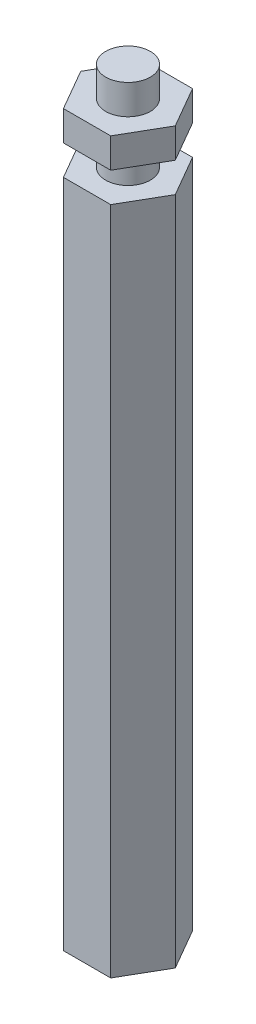
ISO-10303-21;
HEADER;
FILE_DESCRIPTION(('STEP AP214'),'2;1');
FILE_NAME('part.step','',(''),(''),'','','');
FILE_SCHEMA(('AUTOMOTIVE_DESIGN { 1 0 10303 214 1 1 1 1 }'));
ENDSEC;
DATA;
#1=APPLICATION_CONTEXT('core data for automotive mechanical design processes');
#2=APPLICATION_PROTOCOL_DEFINITION('international standard','automotive_design',2000,#1);
#3=PRODUCT_CONTEXT('',#1,'mechanical');
#4=PRODUCT('Part','Part','',(#3));
#5=PRODUCT_RELATED_PRODUCT_CATEGORY('part','',(#4));
#6=PRODUCT_DEFINITION_FORMATION('','',#4);
#7=PRODUCT_DEFINITION_CONTEXT('part definition',#1,'design');
#8=PRODUCT_DEFINITION('design','',#6,#7);
#9=PRODUCT_DEFINITION_SHAPE('','',#8);
#10=(LENGTH_UNIT() NAMED_UNIT(*) SI_UNIT(.MILLI.,.METRE.));
#11=(NAMED_UNIT(*) PLANE_ANGLE_UNIT() SI_UNIT($,.RADIAN.));
#12=(NAMED_UNIT(*) SI_UNIT($,.STERADIAN.) SOLID_ANGLE_UNIT());
#13=UNCERTAINTY_MEASURE_WITH_UNIT(LENGTH_MEASURE(1.E-05),#10,'distance_accuracy_value','');
#14=(GEOMETRIC_REPRESENTATION_CONTEXT(3) GLOBAL_UNCERTAINTY_ASSIGNED_CONTEXT((#13)) GLOBAL_UNIT_ASSIGNED_CONTEXT((#10,
#11,#12)) REPRESENTATION_CONTEXT('',''));
#15=CARTESIAN_POINT('',(0.,0.,0.));
#16=DIRECTION('',(0.,0.,1.));
#17=DIRECTION('',(1.,0.,0.));
#18=AXIS2_PLACEMENT_3D('',#15,#16,#17);
#19=CARTESIAN_POINT('',(0.,51.,0.));
#20=DIRECTION('',(0.,1.,0.));
#21=DIRECTION('',(0.,0.,1.));
#22=AXIS2_PLACEMENT_3D('',#19,#20,#21);
#23=PLANE('',#22);
#24=CARTESIAN_POINT('',(0.,51.,0.));
#25=DIRECTION('',(0.,-1.,0.));
#26=DIRECTION('',(0.,0.,-1.));
#27=AXIS2_PLACEMENT_3D('',#24,#25,#26);
#28=CIRCLE('',#27,1.5);
#29=CARTESIAN_POINT('',(0.,51.,-1.5));
#30=VERTEX_POINT('',#29);
#31=EDGE_CURVE('E20',#30,#30,#28,.T.);
#32=ORIENTED_EDGE('',*,*,#31,.F.);
#33=EDGE_LOOP('',(#32));
#34=FACE_BOUND('',#33,.T.);
#35=ADVANCED_FACE('F17',(#34),#23,.T.);
#36=CARTESIAN_POINT('',(0.,51.,0.));
#37=DIRECTION('',(0.,-1.,0.));
#38=DIRECTION('',(0.,0.,-1.));
#39=AXIS2_PLACEMENT_3D('',#36,#37,#38);
#40=CYLINDRICAL_SURFACE('',#39,1.5);
#41=CARTESIAN_POINT('',(0.,49.,0.));
#42=DIRECTION('',(0.,-1.,0.));
#43=DIRECTION('',(0.,0.,-1.));
#44=AXIS2_PLACEMENT_3D('',#41,#42,#43);
#45=CIRCLE('',#44,1.5);
#46=CARTESIAN_POINT('',(0.,49.,-1.5));
#47=VERTEX_POINT('',#46);
#48=EDGE_CURVE('E116',#47,#47,#45,.T.);
#49=ORIENTED_EDGE('',*,*,#48,.F.);
#50=EDGE_LOOP('',(#49));
#51=FACE_BOUND('',#50,.T.);
#52=ORIENTED_EDGE('',*,*,#31,.T.);
#53=EDGE_LOOP('',(#52));
#54=FACE_BOUND('',#53,.T.);
#55=ADVANCED_FACE('F152',(#51,#54),#40,.T.);
#56=CARTESIAN_POINT('',(0.,49.,0.));
#57=DIRECTION('',(0.,1.,0.));
#58=DIRECTION('',(0.,0.,1.));
#59=AXIS2_PLACEMENT_3D('',#56,#57,#58);
#60=PLANE('',#59);
#61=DIRECTION('',(-0.5,0.,-0.866025403784439));
#62=VECTOR('',#61,1.);
#63=CARTESIAN_POINT('',(-3.17542648054294,49.,0.));
#64=LINE('',#63,#62);
#65=CARTESIAN_POINT('',(-3.17542648054294,49.,0.));
#66=VERTEX_POINT('',#65);
#67=CARTESIAN_POINT('',(-1.58771324027147,49.,2.75));
#68=VERTEX_POINT('',#67);
#69=EDGE_CURVE('E375',#66,#68,#64,.F.);
#70=ORIENTED_EDGE('',*,*,#69,.T.);
#71=DIRECTION('',(-1.,0.,0.));
#72=VECTOR('',#71,1.);
#73=CARTESIAN_POINT('',(-1.58771324027147,49.,2.75));
#74=LINE('',#73,#72);
#75=CARTESIAN_POINT('',(1.58771324027147,49.,2.75));
#76=VERTEX_POINT('',#75);
#77=EDGE_CURVE('E383',#68,#76,#74,.F.);
#78=ORIENTED_EDGE('',*,*,#77,.T.);
#79=DIRECTION('',(-0.5,0.,0.866025403784439));
#80=VECTOR('',#79,1.);
#81=CARTESIAN_POINT('',(1.58771324027147,49.,2.75));
#82=LINE('',#81,#80);
#83=CARTESIAN_POINT('',(3.17542648054294,49.,0.));
#84=VERTEX_POINT('',#83);
#85=EDGE_CURVE('E110',#76,#84,#82,.F.);
#86=ORIENTED_EDGE('',*,*,#85,.T.);
#87=DIRECTION('',(0.5,0.,0.866025403784439));
#88=VECTOR('',#87,1.);
#89=CARTESIAN_POINT('',(3.17542648054294,49.,0.));
#90=LINE('',#89,#88);
#91=CARTESIAN_POINT('',(1.58771324027147,49.,-2.75));
#92=VERTEX_POINT('',#91);
#93=EDGE_CURVE('E106',#84,#92,#90,.F.);
#94=ORIENTED_EDGE('',*,*,#93,.T.);
#95=DIRECTION('',(1.,0.,0.));
#96=VECTOR('',#95,1.);
#97=CARTESIAN_POINT('',(1.58771324027147,49.,-2.75));
#98=LINE('',#97,#96);
#99=CARTESIAN_POINT('',(-1.58771324027147,49.,-2.75));
#100=VERTEX_POINT('',#99);
#101=EDGE_CURVE('E103',#92,#100,#98,.F.);
#102=ORIENTED_EDGE('',*,*,#101,.T.);
#103=DIRECTION('',(0.5,0.,-0.866025403784439));
#104=VECTOR('',#103,1.);
#105=CARTESIAN_POINT('',(-1.58771324027147,49.,-2.75));
#106=LINE('',#105,#104);
#107=EDGE_CURVE('E369',#100,#66,#106,.F.);
#108=ORIENTED_EDGE('',*,*,#107,.T.);
#109=EDGE_LOOP('',(#70,#78,#86,#94,#102,#108));
#110=FACE_BOUND('',#109,.T.);
#111=ORIENTED_EDGE('',*,*,#48,.T.);
#112=EDGE_LOOP('',(#111));
#113=FACE_BOUND('',#112,.T.);
#114=ADVANCED_FACE('F107',(#110,#113),#60,.T.);
#115=CARTESIAN_POINT('',(3.17542648054294,49.,0.));
#116=DIRECTION('',(-0.866025403784439,0.,0.5));
#117=DIRECTION('',(0.5,0.,0.866025403784439));
#118=AXIS2_PLACEMENT_3D('',#115,#116,#117);
#119=PLANE('',#118);
#120=DIRECTION('',(0.,1.,0.));
#121=VECTOR('',#120,1.);
#122=CARTESIAN_POINT('',(1.58771324027147,49.,-2.75));
#123=LINE('',#122,#121);
#124=CARTESIAN_POINT('',(1.58771324027147,47.,-2.75));
#125=VERTEX_POINT('',#124);
#126=EDGE_CURVE('E115',#125,#92,#123,.T.);
#127=ORIENTED_EDGE('',*,*,#126,.T.);
#128=ORIENTED_EDGE('',*,*,#93,.F.);
#129=DIRECTION('',(0.,1.,0.));
#130=VECTOR('',#129,1.);
#131=CARTESIAN_POINT('',(3.17542648054294,49.,0.));
#132=LINE('',#131,#130);
#133=CARTESIAN_POINT('',(3.17542648054294,47.,0.));
#134=VERTEX_POINT('',#133);
#135=EDGE_CURVE('E389',#84,#134,#132,.F.);
#136=ORIENTED_EDGE('',*,*,#135,.T.);
#137=DIRECTION('',(-0.5,0.,-0.866025403784439));
#138=VECTOR('',#137,1.);
#139=CARTESIAN_POINT('',(3.17542648054294,47.,0.));
#140=LINE('',#139,#138);
#141=EDGE_CURVE('E127',#134,#125,#140,.T.);
#142=ORIENTED_EDGE('',*,*,#141,.T.);
#143=EDGE_LOOP('',(#127,#128,#136,#142));
#144=FACE_BOUND('',#143,.T.);
#145=ADVANCED_FACE('F126',(#144),#119,.F.);
#146=CARTESIAN_POINT('',(1.58771324027147,49.,-2.75));
#147=DIRECTION('',(0.,0.,1.));
#148=DIRECTION('',(1.,0.,0.));
#149=AXIS2_PLACEMENT_3D('',#146,#147,#148);
#150=PLANE('',#149);
#151=DIRECTION('',(0.,1.,0.));
#152=VECTOR('',#151,1.);
#153=CARTESIAN_POINT('',(-1.58771324027147,49.,-2.75));
#154=LINE('',#153,#152);
#155=CARTESIAN_POINT('',(-1.58771324027147,47.,-2.75));
#156=VERTEX_POINT('',#155);
#157=EDGE_CURVE('E123',#156,#100,#154,.T.);
#158=ORIENTED_EDGE('',*,*,#157,.T.);
#159=ORIENTED_EDGE('',*,*,#101,.F.);
#160=ORIENTED_EDGE('',*,*,#126,.F.);
#161=DIRECTION('',(1.,0.,0.));
#162=VECTOR('',#161,1.);
#163=CARTESIAN_POINT('',(0.,47.,-2.75));
#164=LINE('',#163,#162);
#165=EDGE_CURVE('E392',#125,#156,#164,.F.);
#166=ORIENTED_EDGE('',*,*,#165,.T.);
#167=EDGE_LOOP('',(#158,#159,#160,#166));
#168=FACE_BOUND('',#167,.T.);
#169=ADVANCED_FACE('F120',(#168),#150,.F.);
#170=CARTESIAN_POINT('',(-1.58771324027147,49.,-2.75));
#171=DIRECTION('',(0.866025403784439,0.,0.5));
#172=DIRECTION('',(0.5,0.,-0.866025403784439));
#173=AXIS2_PLACEMENT_3D('',#170,#171,#172);
#174=PLANE('',#173);
#175=DIRECTION('',(0.,1.,0.));
#176=VECTOR('',#175,1.);
#177=CARTESIAN_POINT('',(-3.17542648054294,49.,0.));
#178=LINE('',#177,#176);
#179=CARTESIAN_POINT('',(-3.17542648054294,47.,0.));
#180=VERTEX_POINT('',#179);
#181=EDGE_CURVE('E368',#180,#66,#178,.T.);
#182=ORIENTED_EDGE('',*,*,#181,.T.);
#183=ORIENTED_EDGE('',*,*,#107,.F.);
#184=ORIENTED_EDGE('',*,*,#157,.F.);
#185=DIRECTION('',(-0.5,0.,0.866025403784439));
#186=VECTOR('',#185,1.);
#187=CARTESIAN_POINT('',(-1.58771324027147,47.,-2.75));
#188=LINE('',#187,#186);
#189=EDGE_CURVE('E371',#156,#180,#188,.T.);
#190=ORIENTED_EDGE('',*,*,#189,.T.);
#191=EDGE_LOOP('',(#182,#183,#184,#190));
#192=FACE_BOUND('',#191,.T.);
#193=ADVANCED_FACE('F222',(#192),#174,.F.);
#194=CARTESIAN_POINT('',(-3.17542648054294,49.,0.));
#195=DIRECTION('',(0.866025403784439,0.,-0.5));
#196=DIRECTION('',(-0.5,0.,-0.866025403784439));
#197=AXIS2_PLACEMENT_3D('',#194,#195,#196);
#198=PLANE('',#197);
#199=DIRECTION('',(0.,1.,0.));
#200=VECTOR('',#199,1.);
#201=CARTESIAN_POINT('',(-1.58771324027147,49.,2.75));
#202=LINE('',#201,#200);
#203=CARTESIAN_POINT('',(-1.58771324027147,47.,2.75));
#204=VERTEX_POINT('',#203);
#205=EDGE_CURVE('E377',#204,#68,#202,.T.);
#206=ORIENTED_EDGE('',*,*,#205,.T.);
#207=ORIENTED_EDGE('',*,*,#69,.F.);
#208=ORIENTED_EDGE('',*,*,#181,.F.);
#209=DIRECTION('',(0.5,0.,0.866025403784439));
#210=VECTOR('',#209,1.);
#211=CARTESIAN_POINT('',(-3.17542648054294,47.,0.));
#212=LINE('',#211,#210);
#213=EDGE_CURVE('E395',#180,#204,#212,.T.);
#214=ORIENTED_EDGE('',*,*,#213,.T.);
#215=EDGE_LOOP('',(#206,#207,#208,#214));
#216=FACE_BOUND('',#215,.T.);
#217=ADVANCED_FACE('F218',(#216),#198,.F.);
#218=CARTESIAN_POINT('',(-1.58771324027147,49.,2.75));
#219=DIRECTION('',(0.,0.,-1.));
#220=DIRECTION('',(-1.,0.,0.));
#221=AXIS2_PLACEMENT_3D('',#218,#219,#220);
#222=PLANE('',#221);
#223=DIRECTION('',(0.,1.,0.));
#224=VECTOR('',#223,1.);
#225=CARTESIAN_POINT('',(1.58771324027147,49.,2.75));
#226=LINE('',#225,#224);
#227=CARTESIAN_POINT('',(1.58771324027147,47.,2.75));
#228=VERTEX_POINT('',#227);
#229=EDGE_CURVE('E385',#228,#76,#226,.T.);
#230=ORIENTED_EDGE('',*,*,#229,.T.);
#231=ORIENTED_EDGE('',*,*,#77,.F.);
#232=ORIENTED_EDGE('',*,*,#205,.F.);
#233=DIRECTION('',(1.,0.,0.));
#234=VECTOR('',#233,1.);
#235=CARTESIAN_POINT('',(0.,47.,2.75));
#236=LINE('',#235,#234);
#237=EDGE_CURVE('E397',#204,#228,#236,.T.);
#238=ORIENTED_EDGE('',*,*,#237,.T.);
#239=EDGE_LOOP('',(#230,#231,#232,#238));
#240=FACE_BOUND('',#239,.T.);
#241=ADVANCED_FACE('F214',(#240),#222,.F.);
#242=CARTESIAN_POINT('',(1.58771324027147,49.,2.75));
#243=DIRECTION('',(-0.866025403784439,0.,-0.5));
#244=DIRECTION('',(-0.5,0.,0.866025403784439));
#245=AXIS2_PLACEMENT_3D('',#242,#243,#244);
#246=PLANE('',#245);
#247=ORIENTED_EDGE('',*,*,#135,.F.);
#248=ORIENTED_EDGE('',*,*,#85,.F.);
#249=ORIENTED_EDGE('',*,*,#229,.F.);
#250=DIRECTION('',(0.5,0.,-0.866025403784439));
#251=VECTOR('',#250,1.);
#252=CARTESIAN_POINT('',(1.58771324027147,47.,2.75));
#253=LINE('',#252,#251);
#254=EDGE_CURVE('E146',#228,#134,#253,.T.);
#255=ORIENTED_EDGE('',*,*,#254,.T.);
#256=EDGE_LOOP('',(#247,#248,#249,#255));
#257=FACE_BOUND('',#256,.T.);
#258=ADVANCED_FACE('F210',(#257),#246,.F.);
#259=CARTESIAN_POINT('',(0.,47.,0.));
#260=DIRECTION('',(0.,1.,0.));
#261=DIRECTION('',(0.,0.,1.));
#262=AXIS2_PLACEMENT_3D('',#259,#260,#261);
#263=PLANE('',#262);
#264=ORIENTED_EDGE('',*,*,#237,.F.);
#265=ORIENTED_EDGE('',*,*,#213,.F.);
#266=ORIENTED_EDGE('',*,*,#189,.F.);
#267=ORIENTED_EDGE('',*,*,#165,.F.);
#268=ORIENTED_EDGE('',*,*,#141,.F.);
#269=ORIENTED_EDGE('',*,*,#254,.F.);
#270=EDGE_LOOP('',(#264,#265,#266,#267,#268,#269));
#271=FACE_BOUND('',#270,.T.);
#272=CARTESIAN_POINT('',(0.,47.,0.));
#273=DIRECTION('',(0.,-1.,0.));
#274=DIRECTION('',(0.,0.,-1.));
#275=AXIS2_PLACEMENT_3D('',#272,#273,#274);
#276=CIRCLE('',#275,1.5);
#277=CARTESIAN_POINT('',(0.,47.,-1.5));
#278=VERTEX_POINT('',#277);
#279=EDGE_CURVE('E144',#278,#278,#276,.T.);
#280=ORIENTED_EDGE('',*,*,#279,.F.);
#281=EDGE_LOOP('',(#280));
#282=FACE_BOUND('',#281,.T.);
#283=ADVANCED_FACE('F206',(#271,#282),#263,.F.);
#284=CARTESIAN_POINT('',(0.,6.,0.));
#285=DIRECTION('',(0.,-1.,0.));
#286=DIRECTION('',(0.,0.,-1.));
#287=AXIS2_PLACEMENT_3D('',#284,#285,#286);
#288=PLANE('',#287);
#289=CARTESIAN_POINT('',(0.,6.,0.));
#290=DIRECTION('',(0.,-1.,0.));
#291=DIRECTION('',(0.,0.,-1.));
#292=AXIS2_PLACEMENT_3D('',#289,#290,#291);
#293=CIRCLE('',#292,1.5);
#294=CARTESIAN_POINT('',(0.,6.,-1.5));
#295=VERTEX_POINT('',#294);
#296=EDGE_CURVE('E140',#295,#295,#293,.T.);
#297=ORIENTED_EDGE('',*,*,#296,.T.);
#298=EDGE_LOOP('',(#297));
#299=FACE_BOUND('',#298,.T.);
#300=ADVANCED_FACE('F202',(#299),#288,.T.);
#301=CARTESIAN_POINT('',(0.,51.,0.));
#302=DIRECTION('',(0.,-1.,0.));
#303=DIRECTION('',(0.,0.,-1.));
#304=AXIS2_PLACEMENT_3D('',#301,#302,#303);
#305=CYLINDRICAL_SURFACE('',#304,1.5);
#306=CARTESIAN_POINT('',(0.,45.,0.));
#307=DIRECTION('',(0.,-1.,0.));
#308=DIRECTION('',(0.,0.,-1.));
#309=AXIS2_PLACEMENT_3D('',#306,#307,#308);
#310=CIRCLE('',#309,1.5);
#311=CARTESIAN_POINT('',(0.,45.,-1.5));
#312=VERTEX_POINT('',#311);
#313=EDGE_CURVE('E135',#312,#312,#310,.T.);
#314=ORIENTED_EDGE('',*,*,#313,.F.);
#315=EDGE_LOOP('',(#314));
#316=FACE_BOUND('',#315,.T.);
#317=ORIENTED_EDGE('',*,*,#279,.T.);
#318=EDGE_LOOP('',(#317));
#319=FACE_BOUND('',#318,.T.);
#320=ADVANCED_FACE('F198',(#316,#319),#305,.T.);
#321=CARTESIAN_POINT('',(0.,6.,0.));
#322=DIRECTION('',(0.,-1.,0.));
#323=DIRECTION('',(0.,0.,-1.));
#324=AXIS2_PLACEMENT_3D('',#321,#322,#323);
#325=CYLINDRICAL_SURFACE('',#324,1.5);
#326=ORIENTED_EDGE('',*,*,#296,.F.);
#327=EDGE_LOOP('',(#326));
#328=FACE_BOUND('',#327,.T.);
#329=CARTESIAN_POINT('',(0.,0.,0.));
#330=DIRECTION('',(0.,-1.,0.));
#331=DIRECTION('',(0.,0.,-1.));
#332=AXIS2_PLACEMENT_3D('',#329,#330,#331);
#333=CIRCLE('',#332,1.5);
#334=CARTESIAN_POINT('',(0.,0.,-1.5));
#335=VERTEX_POINT('',#334);
#336=EDGE_CURVE('E131',#335,#335,#333,.T.);
#337=ORIENTED_EDGE('',*,*,#336,.T.);
#338=EDGE_LOOP('',(#337));
#339=FACE_BOUND('',#338,.T.);
#340=ADVANCED_FACE('F194',(#328,#339),#325,.F.);
#341=CARTESIAN_POINT('',(1.58771324027147,45.,-2.75));
#342=DIRECTION('',(0.,0.,1.));
#343=DIRECTION('',(1.,0.,0.));
#344=AXIS2_PLACEMENT_3D('',#341,#342,#343);
#345=PLANE('',#344);
#346=DIRECTION('',(0.,1.,0.));
#347=VECTOR('',#346,1.);
#348=CARTESIAN_POINT('',(-1.58771324027147,45.,-2.75));
#349=LINE('',#348,#347);
#350=CARTESIAN_POINT('',(-1.58771324027147,0.,-2.75));
#351=VERTEX_POINT('',#350);
#352=CARTESIAN_POINT('',(-1.58771324027147,45.,-2.75));
#353=VERTEX_POINT('',#352);
#354=EDGE_CURVE('E143',#351,#353,#349,.T.);
#355=ORIENTED_EDGE('',*,*,#354,.T.);
#356=DIRECTION('',(1.,0.,0.));
#357=VECTOR('',#356,1.);
#358=CARTESIAN_POINT('',(0.,45.,-2.75));
#359=LINE('',#358,#357);
#360=CARTESIAN_POINT('',(1.58771324027147,45.,-2.75));
#361=VERTEX_POINT('',#360);
#362=EDGE_CURVE('E138',#361,#353,#359,.F.);
#363=ORIENTED_EDGE('',*,*,#362,.F.);
#364=DIRECTION('',(0.,1.,0.));
#365=VECTOR('',#364,1.);
#366=CARTESIAN_POINT('',(1.58771324027147,45.,-2.75000000000001));
#367=LINE('',#366,#365);
#368=CARTESIAN_POINT('',(1.58771324027147,0.,-2.75000000000001));
#369=VERTEX_POINT('',#368);
#370=EDGE_CURVE('E134',#361,#369,#367,.F.);
#371=ORIENTED_EDGE('',*,*,#370,.T.);
#372=DIRECTION('',(1.,0.,0.));
#373=VECTOR('',#372,1.);
#374=CARTESIAN_POINT('',(0.,0.,-2.75));
#375=LINE('',#374,#373);
#376=EDGE_CURVE('E421',#369,#351,#375,.F.);
#377=ORIENTED_EDGE('',*,*,#376,.T.);
#378=EDGE_LOOP('',(#355,#363,#371,#377));
#379=FACE_BOUND('',#378,.T.);
#380=ADVANCED_FACE('F190',(#379),#345,.F.);
#381=CARTESIAN_POINT('',(-1.58771324027147,45.,-2.75));
#382=DIRECTION('',(0.866025403784439,0.,0.5));
#383=DIRECTION('',(0.5,0.,-0.866025403784439));
#384=AXIS2_PLACEMENT_3D('',#381,#382,#383);
#385=PLANE('',#384);
#386=DIRECTION('',(0.,1.,0.));
#387=VECTOR('',#386,1.);
#388=CARTESIAN_POINT('',(-3.17542648054294,45.,0.));
#389=LINE('',#388,#387);
#390=CARTESIAN_POINT('',(-3.17542648054295,0.,0.));
#391=VERTEX_POINT('',#390);
#392=CARTESIAN_POINT('',(-3.17542648054294,45.,0.));
#393=VERTEX_POINT('',#392);
#394=EDGE_CURVE('E404',#391,#393,#389,.T.);
#395=ORIENTED_EDGE('',*,*,#394,.T.);
#396=DIRECTION('',(-0.5,0.,0.866025403784438));
#397=VECTOR('',#396,1.);
#398=CARTESIAN_POINT('',(-1.58771324027147,45.,-2.75));
#399=LINE('',#398,#397);
#400=EDGE_CURVE('E410',#353,#393,#399,.T.);
#401=ORIENTED_EDGE('',*,*,#400,.F.);
#402=ORIENTED_EDGE('',*,*,#354,.F.);
#403=DIRECTION('',(-0.5,0.,0.866025403784438));
#404=VECTOR('',#403,1.);
#405=CARTESIAN_POINT('',(-1.58771324027147,0.,-2.75));
#406=LINE('',#405,#404);
#407=EDGE_CURVE('E424',#351,#391,#406,.T.);
#408=ORIENTED_EDGE('',*,*,#407,.T.);
#409=EDGE_LOOP('',(#395,#401,#402,#408));
#410=FACE_BOUND('',#409,.T.);
#411=ADVANCED_FACE('F186',(#410),#385,.F.);
#412=CARTESIAN_POINT('',(-3.17542648054294,45.,0.));
#413=DIRECTION('',(0.866025403784439,0.,-0.5));
#414=DIRECTION('',(-0.5,0.,-0.866025403784439));
#415=AXIS2_PLACEMENT_3D('',#412,#413,#414);
#416=PLANE('',#415);
#417=DIRECTION('',(0.,1.,0.));
#418=VECTOR('',#417,1.);
#419=CARTESIAN_POINT('',(-1.58771324027147,45.,2.75));
#420=LINE('',#419,#418);
#421=CARTESIAN_POINT('',(-1.58771324027147,0.,2.75));
#422=VERTEX_POINT('',#421);
#423=CARTESIAN_POINT('',(-1.58771324027147,45.,2.75));
#424=VERTEX_POINT('',#423);
#425=EDGE_CURVE('E139',#422,#424,#420,.T.);
#426=ORIENTED_EDGE('',*,*,#425,.T.);
#427=DIRECTION('',(0.5,0.,0.866025403784439));
#428=VECTOR('',#427,1.);
#429=CARTESIAN_POINT('',(-3.17542648054294,45.,0.));
#430=LINE('',#429,#428);
#431=EDGE_CURVE('E412',#393,#424,#430,.T.);
#432=ORIENTED_EDGE('',*,*,#431,.F.);
#433=ORIENTED_EDGE('',*,*,#394,.F.);
#434=DIRECTION('',(0.5,0.,0.866025403784439));
#435=VECTOR('',#434,1.);
#436=CARTESIAN_POINT('',(-3.17542648054294,0.,0.));
#437=LINE('',#436,#435);
#438=EDGE_CURVE('E427',#391,#422,#437,.T.);
#439=ORIENTED_EDGE('',*,*,#438,.T.);
#440=EDGE_LOOP('',(#426,#432,#433,#439));
#441=FACE_BOUND('',#440,.T.);
#442=ADVANCED_FACE('F182',(#441),#416,.F.);
#443=CARTESIAN_POINT('',(-1.58771324027147,45.,2.75));
#444=DIRECTION('',(0.,0.,-1.));
#445=DIRECTION('',(-1.,0.,0.));
#446=AXIS2_PLACEMENT_3D('',#443,#444,#445);
#447=PLANE('',#446);
#448=DIRECTION('',(0.,1.,0.));
#449=VECTOR('',#448,1.);
#450=CARTESIAN_POINT('',(1.58771324027147,45.,2.75));
#451=LINE('',#450,#449);
#452=CARTESIAN_POINT('',(1.58771324027147,0.,2.75));
#453=VERTEX_POINT('',#452);
#454=CARTESIAN_POINT('',(1.58771324027147,45.,2.75));
#455=VERTEX_POINT('',#454);
#456=EDGE_CURVE('E433',#453,#455,#451,.T.);
#457=ORIENTED_EDGE('',*,*,#456,.T.);
#458=DIRECTION('',(1.,0.,0.));
#459=VECTOR('',#458,1.);
#460=CARTESIAN_POINT('',(0.,45.,2.75));
#461=LINE('',#460,#459);
#462=EDGE_CURVE('E414',#424,#455,#461,.T.);
#463=ORIENTED_EDGE('',*,*,#462,.F.);
#464=ORIENTED_EDGE('',*,*,#425,.F.);
#465=DIRECTION('',(1.,0.,0.));
#466=VECTOR('',#465,1.);
#467=CARTESIAN_POINT('',(0.,0.,2.75));
#468=LINE('',#467,#466);
#469=EDGE_CURVE('E430',#422,#453,#468,.T.);
#470=ORIENTED_EDGE('',*,*,#469,.T.);
#471=EDGE_LOOP('',(#457,#463,#464,#470));
#472=FACE_BOUND('',#471,.T.);
#473=ADVANCED_FACE('F178',(#472),#447,.F.);
#474=CARTESIAN_POINT('',(0.,45.,0.));
#475=DIRECTION('',(0.,1.,0.));
#476=DIRECTION('',(0.,0.,1.));
#477=AXIS2_PLACEMENT_3D('',#474,#475,#476);
#478=PLANE('',#477);
#479=ORIENTED_EDGE('',*,*,#431,.T.);
#480=ORIENTED_EDGE('',*,*,#462,.T.);
#481=DIRECTION('',(-0.5,0.,0.866025403784439));
#482=VECTOR('',#481,1.);
#483=CARTESIAN_POINT('',(1.58771324027147,45.,2.75));
#484=LINE('',#483,#482);
#485=CARTESIAN_POINT('',(3.17542648054294,45.,0.));
#486=VERTEX_POINT('',#485);
#487=EDGE_CURVE('E436',#455,#486,#484,.F.);
#488=ORIENTED_EDGE('',*,*,#487,.T.);
#489=DIRECTION('',(0.5,0.,0.866025403784439));
#490=VECTOR('',#489,1.);
#491=CARTESIAN_POINT('',(3.17542648054294,45.,0.));
#492=LINE('',#491,#490);
#493=EDGE_CURVE('E416',#486,#361,#492,.F.);
#494=ORIENTED_EDGE('',*,*,#493,.T.);
#495=ORIENTED_EDGE('',*,*,#362,.T.);
#496=ORIENTED_EDGE('',*,*,#400,.T.);
#497=EDGE_LOOP('',(#479,#480,#488,#494,#495,#496));
#498=FACE_BOUND('',#497,.T.);
#499=ORIENTED_EDGE('',*,*,#313,.T.);
#500=EDGE_LOOP('',(#499));
#501=FACE_BOUND('',#500,.T.);
#502=ADVANCED_FACE('F174',(#498,#501),#478,.T.);
#503=CARTESIAN_POINT('',(3.17542648054294,45.,0.));
#504=DIRECTION('',(-0.866025403784439,0.,0.5));
#505=DIRECTION('',(0.5,0.,0.866025403784439));
#506=AXIS2_PLACEMENT_3D('',#503,#504,#505);
#507=PLANE('',#506);
#508=ORIENTED_EDGE('',*,*,#370,.F.);
#509=ORIENTED_EDGE('',*,*,#493,.F.);
#510=DIRECTION('',(0.,1.,0.));
#511=VECTOR('',#510,1.);
#512=CARTESIAN_POINT('',(3.17542648054294,45.,0.));
#513=LINE('',#512,#511);
#514=CARTESIAN_POINT('',(3.17542648054294,0.,0.));
#515=VERTEX_POINT('',#514);
#516=EDGE_CURVE('E26',#486,#515,#513,.F.);
#517=ORIENTED_EDGE('',*,*,#516,.T.);
#518=DIRECTION('',(-0.5,0.,-0.866025403784438));
#519=VECTOR('',#518,1.);
#520=CARTESIAN_POINT('',(3.17542648054294,0.,0.));
#521=LINE('',#520,#519);
#522=EDGE_CURVE('E34',#515,#369,#521,.T.);
#523=ORIENTED_EDGE('',*,*,#522,.T.);
#524=EDGE_LOOP('',(#508,#509,#517,#523));
#525=FACE_BOUND('',#524,.T.);
#526=ADVANCED_FACE('F168',(#525),#507,.F.);
#527=CARTESIAN_POINT('',(0.,0.,0.));
#528=DIRECTION('',(0.,1.,0.));
#529=DIRECTION('',(0.,0.,1.));
#530=AXIS2_PLACEMENT_3D('',#527,#528,#529);
#531=PLANE('',#530);
#532=ORIENTED_EDGE('',*,*,#469,.F.);
#533=ORIENTED_EDGE('',*,*,#438,.F.);
#534=ORIENTED_EDGE('',*,*,#407,.F.);
#535=ORIENTED_EDGE('',*,*,#376,.F.);
#536=ORIENTED_EDGE('',*,*,#522,.F.);
#537=DIRECTION('',(-0.5,0.,0.866025403784439));
#538=VECTOR('',#537,1.);
#539=CARTESIAN_POINT('',(1.58771324027147,0.,2.75));
#540=LINE('',#539,#538);
#541=EDGE_CURVE('E11',#515,#453,#540,.T.);
#542=ORIENTED_EDGE('',*,*,#541,.T.);
#543=EDGE_LOOP('',(#532,#533,#534,#535,#536,#542));
#544=FACE_BOUND('',#543,.T.);
#545=ORIENTED_EDGE('',*,*,#336,.F.);
#546=EDGE_LOOP('',(#545));
#547=FACE_BOUND('',#546,.T.);
#548=ADVANCED_FACE('F162',(#544,#547),#531,.F.);
#549=CARTESIAN_POINT('',(1.58771324027147,45.,2.75));
#550=DIRECTION('',(-0.866025403784439,0.,-0.5));
#551=DIRECTION('',(-0.5,0.,0.866025403784439));
#552=AXIS2_PLACEMENT_3D('',#549,#550,#551);
#553=PLANE('',#552);
#554=ORIENTED_EDGE('',*,*,#516,.F.);
#555=ORIENTED_EDGE('',*,*,#487,.F.);
#556=ORIENTED_EDGE('',*,*,#456,.F.);
#557=ORIENTED_EDGE('',*,*,#541,.F.);
#558=EDGE_LOOP('',(#554,#555,#556,#557));
#559=FACE_BOUND('',#558,.T.);
#560=ADVANCED_FACE('F160',(#559),#553,.F.);
#561=CLOSED_SHELL('',(#35,#55,#114,#145,#169,#193,#217,#241,#258,#283,#300,#320,#340,#380,#411,
#442,#473,#502,#526,#548,#560));
#562=MANIFOLD_SOLID_BREP('B1',#561);
#563=ADVANCED_BREP_SHAPE_REPRESENTATION('',(#18,#562),#14);
#564=SHAPE_DEFINITION_REPRESENTATION(#9,#563);
ENDSEC;
END-ISO-10303-21;
